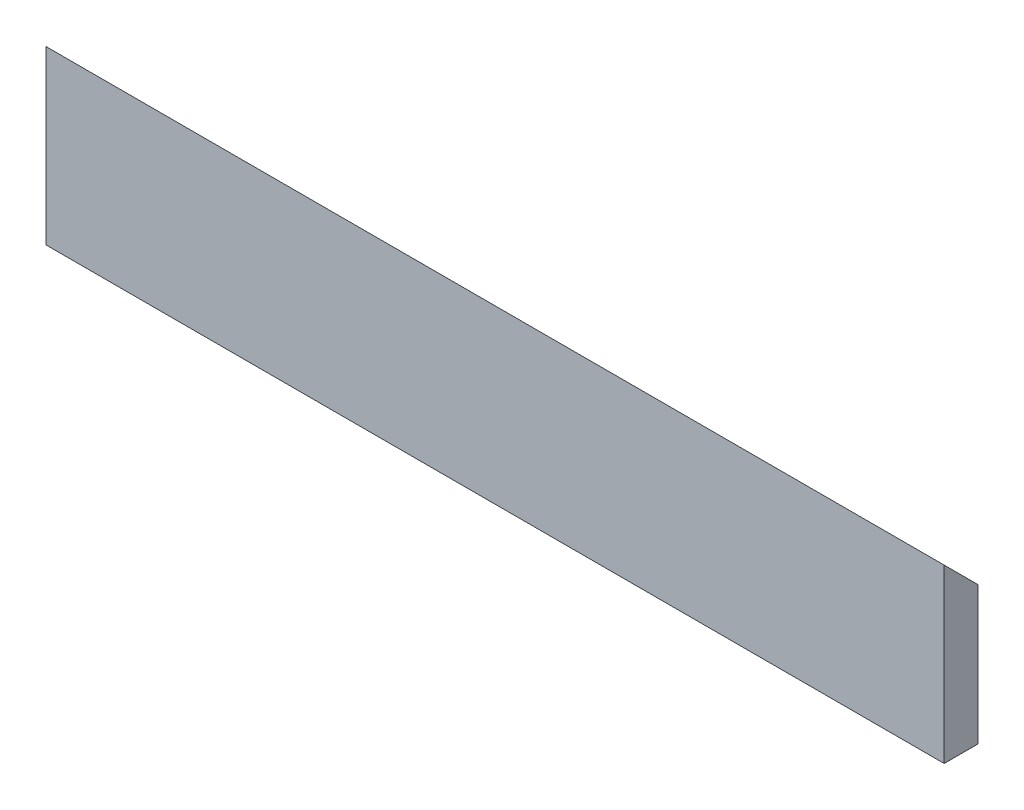
ISO-10303-21;
HEADER;
FILE_DESCRIPTION(('STEP AP214'),'2;1');
FILE_NAME('part.step','',(''),(''),'','','');
FILE_SCHEMA(('AUTOMOTIVE_DESIGN { 1 0 10303 214 1 1 1 1 }'));
ENDSEC;
DATA;
#1=APPLICATION_CONTEXT('core data for automotive mechanical design processes');
#2=APPLICATION_PROTOCOL_DEFINITION('international standard','automotive_design',2000,#1);
#3=PRODUCT_CONTEXT('',#1,'mechanical');
#4=PRODUCT('Part','Part','',(#3));
#5=PRODUCT_RELATED_PRODUCT_CATEGORY('part','',(#4));
#6=PRODUCT_DEFINITION_FORMATION('','',#4);
#7=PRODUCT_DEFINITION_CONTEXT('part definition',#1,'design');
#8=PRODUCT_DEFINITION('design','',#6,#7);
#9=PRODUCT_DEFINITION_SHAPE('','',#8);
#10=(LENGTH_UNIT() NAMED_UNIT(*) SI_UNIT(.MILLI.,.METRE.));
#11=(NAMED_UNIT(*) PLANE_ANGLE_UNIT() SI_UNIT($,.RADIAN.));
#12=(NAMED_UNIT(*) SI_UNIT($,.STERADIAN.) SOLID_ANGLE_UNIT());
#13=UNCERTAINTY_MEASURE_WITH_UNIT(LENGTH_MEASURE(1.E-05),#10,'distance_accuracy_value','');
#14=(GEOMETRIC_REPRESENTATION_CONTEXT(3) GLOBAL_UNCERTAINTY_ASSIGNED_CONTEXT((#13)) GLOBAL_UNIT_ASSIGNED_CONTEXT((#10,
#11,#12)) REPRESENTATION_CONTEXT('',''));
#15=CARTESIAN_POINT('',(0.,0.,0.));
#16=DIRECTION('',(0.,0.,1.));
#17=DIRECTION('',(1.,0.,0.));
#18=AXIS2_PLACEMENT_3D('',#15,#16,#17);
#19=CARTESIAN_POINT('',(0.,0.,15.));
#20=DIRECTION('',(1.,0.,0.));
#21=DIRECTION('',(0.,0.,-1.));
#22=AXIS2_PLACEMENT_3D('',#19,#20,#21);
#23=PLANE('',#22);
#24=DIRECTION('',(0.,-1.,0.));
#25=VECTOR('',#24,1.);
#26=CARTESIAN_POINT('',(0.,0.,15.));
#27=LINE('',#26,#25);
#28=CARTESIAN_POINT('',(0.,76.2,15.));
#29=VERTEX_POINT('',#28);
#30=CARTESIAN_POINT('',(0.,0.,15.));
#31=VERTEX_POINT('',#30);
#32=EDGE_CURVE('E88',#29,#31,#27,.T.);
#33=ORIENTED_EDGE('',*,*,#32,.F.);
#34=DIRECTION('',(0.,0.707106781186547,0.707106781186547));
#35=VECTOR('',#34,1.);
#36=CARTESIAN_POINT('',(0.,76.2,15.));
#37=LINE('',#36,#35);
#38=CARTESIAN_POINT('',(0.,61.2,0.));
#39=VERTEX_POINT('',#38);
#40=EDGE_CURVE('E137',#39,#29,#37,.T.);
#41=ORIENTED_EDGE('',*,*,#40,.F.);
#42=DIRECTION('',(0.,-1.,0.));
#43=VECTOR('',#42,1.);
#44=CARTESIAN_POINT('',(0.,0.,0.));
#45=LINE('',#44,#43);
#46=CARTESIAN_POINT('',(0.,0.,0.));
#47=VERTEX_POINT('',#46);
#48=EDGE_CURVE('E78',#39,#47,#45,.T.);
#49=ORIENTED_EDGE('',*,*,#48,.T.);
#50=DIRECTION('',(0.,0.,-1.));
#51=VECTOR('',#50,1.);
#52=CARTESIAN_POINT('',(0.,0.,15.));
#53=LINE('',#52,#51);
#54=EDGE_CURVE('E11',#31,#47,#53,.T.);
#55=ORIENTED_EDGE('',*,*,#54,.F.);
#56=EDGE_LOOP('',(#33,#41,#49,#55));
#57=FACE_BOUND('',#56,.T.);
#58=ADVANCED_FACE('F33',(#57),#23,.F.);
#59=CARTESIAN_POINT('',(322.1,0.,15.));
#60=DIRECTION('',(0.,1.,0.));
#61=DIRECTION('',(0.,0.,1.));
#62=AXIS2_PLACEMENT_3D('',#59,#60,#61);
#63=PLANE('',#62);
#64=DIRECTION('',(1.,0.,0.));
#65=VECTOR('',#64,1.);
#66=CARTESIAN_POINT('',(322.1,0.,0.));
#67=LINE('',#66,#65);
#68=CARTESIAN_POINT('',(398.3,0.,0.));
#69=VERTEX_POINT('',#68);
#70=EDGE_CURVE('E69',#47,#69,#67,.T.);
#71=ORIENTED_EDGE('',*,*,#70,.T.);
#72=DIRECTION('',(0.,0.,-1.));
#73=VECTOR('',#72,1.);
#74=CARTESIAN_POINT('',(398.3,0.,15.));
#75=LINE('',#74,#73);
#76=CARTESIAN_POINT('',(398.3,0.,15.));
#77=VERTEX_POINT('',#76);
#78=EDGE_CURVE('E41',#77,#69,#75,.T.);
#79=ORIENTED_EDGE('',*,*,#78,.F.);
#80=DIRECTION('',(1.,0.,0.));
#81=VECTOR('',#80,1.);
#82=CARTESIAN_POINT('',(0.,0.,15.));
#83=LINE('',#82,#81);
#84=EDGE_CURVE('E57',#31,#77,#83,.T.);
#85=ORIENTED_EDGE('',*,*,#84,.F.);
#86=ORIENTED_EDGE('',*,*,#54,.T.);
#87=EDGE_LOOP('',(#71,#79,#85,#86));
#88=FACE_BOUND('',#87,.T.);
#89=ADVANCED_FACE('F71',(#88),#63,.F.);
#90=CARTESIAN_POINT('',(398.3,76.2,15.));
#91=DIRECTION('',(-1.,0.,0.));
#92=DIRECTION('',(0.,0.,1.));
#93=AXIS2_PLACEMENT_3D('',#90,#91,#92);
#94=PLANE('',#93);
#95=DIRECTION('',(0.,1.,0.));
#96=VECTOR('',#95,1.);
#97=CARTESIAN_POINT('',(398.3,76.2,0.));
#98=LINE('',#97,#96);
#99=CARTESIAN_POINT('',(398.3,61.2,0.));
#100=VERTEX_POINT('',#99);
#101=EDGE_CURVE('E77',#69,#100,#98,.T.);
#102=ORIENTED_EDGE('',*,*,#101,.T.);
#103=DIRECTION('',(0.,0.707106781186547,0.707106781186547));
#104=VECTOR('',#103,1.);
#105=CARTESIAN_POINT('',(398.3,76.2,15.));
#106=LINE('',#105,#104);
#107=CARTESIAN_POINT('',(398.3,76.2,15.));
#108=VERTEX_POINT('',#107);
#109=EDGE_CURVE('E48',#100,#108,#106,.T.);
#110=ORIENTED_EDGE('',*,*,#109,.T.);
#111=DIRECTION('',(0.,1.,0.));
#112=VECTOR('',#111,1.);
#113=CARTESIAN_POINT('',(398.3,76.2,15.));
#114=LINE('',#113,#112);
#115=EDGE_CURVE('E83',#77,#108,#114,.T.);
#116=ORIENTED_EDGE('',*,*,#115,.F.);
#117=ORIENTED_EDGE('',*,*,#78,.T.);
#118=EDGE_LOOP('',(#102,#110,#116,#117));
#119=FACE_BOUND('',#118,.T.);
#120=ADVANCED_FACE('F82',(#119),#94,.F.);
#121=CARTESIAN_POINT('',(0.,0.,15.));
#122=DIRECTION('',(0.,0.,-1.));
#123=DIRECTION('',(-1.,0.,0.));
#124=AXIS2_PLACEMENT_3D('',#121,#122,#123);
#125=PLANE('',#124);
#126=ORIENTED_EDGE('',*,*,#32,.T.);
#127=ORIENTED_EDGE('',*,*,#84,.T.);
#128=ORIENTED_EDGE('',*,*,#115,.T.);
#129=DIRECTION('',(-1.,0.,0.));
#130=VECTOR('',#129,1.);
#131=CARTESIAN_POINT('',(322.1,76.2,15.));
#132=LINE('',#131,#130);
#133=EDGE_CURVE('E84',#108,#29,#132,.T.);
#134=ORIENTED_EDGE('',*,*,#133,.T.);
#135=EDGE_LOOP('',(#126,#127,#128,#134));
#136=FACE_BOUND('',#135,.T.);
#137=ADVANCED_FACE('F142',(#136),#125,.F.);
#138=CARTESIAN_POINT('',(0.,0.,0.));
#139=DIRECTION('',(0.,0.,-1.));
#140=DIRECTION('',(-1.,0.,0.));
#141=AXIS2_PLACEMENT_3D('',#138,#139,#140);
#142=PLANE('',#141);
#143=DIRECTION('',(-1.,0.,0.));
#144=VECTOR('',#143,1.);
#145=CARTESIAN_POINT('',(398.3,61.2,0.));
#146=LINE('',#145,#144);
#147=EDGE_CURVE('E87',#100,#39,#146,.T.);
#148=ORIENTED_EDGE('',*,*,#147,.F.);
#149=ORIENTED_EDGE('',*,*,#101,.F.);
#150=ORIENTED_EDGE('',*,*,#70,.F.);
#151=ORIENTED_EDGE('',*,*,#48,.F.);
#152=EDGE_LOOP('',(#148,#149,#150,#151));
#153=FACE_BOUND('',#152,.T.);
#154=ADVANCED_FACE('F86',(#153),#142,.T.);
#155=CARTESIAN_POINT('',(398.3,76.2,15.));
#156=DIRECTION('',(0.,-0.707106781186547,0.707106781186547));
#157=DIRECTION('',(0.,-0.707106781186548,-0.707106781186548));
#158=AXIS2_PLACEMENT_3D('',#155,#156,#157);
#159=PLANE('',#158);
#160=CARTESIAN_POINT('',(157.514854478127,68.7,7.5));
#161=DIRECTION('',(0.,-0.707106781186547,0.707106781186547));
#162=DIRECTION('',(0.,0.707106781186548,0.707106781186548));
#163=AXIS2_PLACEMENT_3D('',#160,#161,#162);
#164=ELLIPSE('',#163,1.41421356237309,0.999999999999998);
#165=CARTESIAN_POINT('',(157.514854478127,69.7,8.5));
#166=VERTEX_POINT('',#165);
#167=EDGE_CURVE('E105',#166,#166,#164,.T.);
#168=ORIENTED_EDGE('',*,*,#167,.T.);
#169=EDGE_LOOP('',(#168));
#170=FACE_BOUND('',#169,.T.);
#171=CARTESIAN_POINT('',(43.2148544781275,68.7000000000008,7.5000000000008));
#172=DIRECTION('',(0.,-0.707106781186547,0.707106781186547));
#173=DIRECTION('',(0.,0.707106781186548,0.707106781186548));
#174=AXIS2_PLACEMENT_3D('',#171,#172,#173);
#175=ELLIPSE('',#174,1.41421356237309,0.999999999999998);
#176=CARTESIAN_POINT('',(43.2148544781275,69.7000000000008,8.5000000000008));
#177=VERTEX_POINT('',#176);
#178=EDGE_CURVE('E121',#177,#177,#175,.T.);
#179=ORIENTED_EDGE('',*,*,#178,.T.);
#180=EDGE_LOOP('',(#179));
#181=FACE_BOUND('',#180,.T.);
#182=CARTESIAN_POINT('',(81.3148544781275,68.7000000000005,7.50000000000053));
#183=DIRECTION('',(0.,-0.707106781186547,0.707106781186547));
#184=DIRECTION('',(0.,0.707106781186548,0.707106781186548));
#185=AXIS2_PLACEMENT_3D('',#182,#183,#184);
#186=ELLIPSE('',#185,1.41421356237309,0.999999999999998);
#187=CARTESIAN_POINT('',(81.3148544781275,69.7000000000005,8.50000000000053));
#188=VERTEX_POINT('',#187);
#189=EDGE_CURVE('E124',#188,#188,#186,.T.);
#190=ORIENTED_EDGE('',*,*,#189,.T.);
#191=EDGE_LOOP('',(#190));
#192=FACE_BOUND('',#191,.T.);
#193=CARTESIAN_POINT('',(119.414854478127,68.7000000000003,7.50000000000027));
#194=DIRECTION('',(0.,-0.707106781186547,0.707106781186547));
#195=DIRECTION('',(0.,0.707106781186548,0.707106781186548));
#196=AXIS2_PLACEMENT_3D('',#193,#194,#195);
#197=ELLIPSE('',#196,1.41421356237309,0.999999999999998);
#198=CARTESIAN_POINT('',(119.414854478127,69.7000000000003,8.50000000000026));
#199=VERTEX_POINT('',#198);
#200=EDGE_CURVE('E127',#199,#199,#197,.T.);
#201=ORIENTED_EDGE('',*,*,#200,.T.);
#202=EDGE_LOOP('',(#201));
#203=FACE_BOUND('',#202,.T.);
#204=CARTESIAN_POINT('',(271.814854478127,68.7,7.5));
#205=DIRECTION('',(0.,-0.707106781186547,0.707106781186547));
#206=DIRECTION('',(0.,0.707106781186548,0.707106781186548));
#207=AXIS2_PLACEMENT_3D('',#204,#205,#206);
#208=ELLIPSE('',#207,1.41421356237317,1.00000000000005);
#209=CARTESIAN_POINT('',(271.814854478127,69.7000000000001,8.50000000000005));
#210=VERTEX_POINT('',#209);
#211=EDGE_CURVE('E130',#210,#210,#208,.T.);
#212=ORIENTED_EDGE('',*,*,#211,.T.);
#213=EDGE_LOOP('',(#212));
#214=FACE_BOUND('',#213,.T.);
#215=CARTESIAN_POINT('',(233.714854478128,68.7,7.5));
#216=DIRECTION('',(0.,-0.707106781186547,0.707106781186547));
#217=DIRECTION('',(0.,0.707106781186548,0.707106781186548));
#218=AXIS2_PLACEMENT_3D('',#215,#216,#217);
#219=ELLIPSE('',#218,1.41421356237309,0.999999999999998);
#220=CARTESIAN_POINT('',(233.714854478128,69.7,8.5));
#221=VERTEX_POINT('',#220);
#222=EDGE_CURVE('E133',#221,#221,#219,.T.);
#223=ORIENTED_EDGE('',*,*,#222,.T.);
#224=EDGE_LOOP('',(#223));
#225=FACE_BOUND('',#224,.T.);
#226=CARTESIAN_POINT('',(195.614854478127,68.7,7.5));
#227=DIRECTION('',(0.,-0.707106781186547,0.707106781186547));
#228=DIRECTION('',(0.,0.707106781186548,0.707106781186548));
#229=AXIS2_PLACEMENT_3D('',#226,#227,#228);
#230=ELLIPSE('',#229,1.41421356237309,0.999999999999998);
#231=CARTESIAN_POINT('',(195.614854478127,69.7,8.5));
#232=VERTEX_POINT('',#231);
#233=EDGE_CURVE('E36',#232,#232,#230,.T.);
#234=ORIENTED_EDGE('',*,*,#233,.T.);
#235=EDGE_LOOP('',(#234));
#236=FACE_BOUND('',#235,.T.);
#237=ORIENTED_EDGE('',*,*,#40,.T.);
#238=ORIENTED_EDGE('',*,*,#133,.F.);
#239=ORIENTED_EDGE('',*,*,#109,.F.);
#240=ORIENTED_EDGE('',*,*,#147,.T.);
#241=EDGE_LOOP('',(#237,#238,#239,#240));
#242=FACE_BOUND('',#241,.T.);
#243=ADVANCED_FACE('F148',(#170,#181,#192,#203,#214,#225,#236,#242),#159,.F.);
#244=CARTESIAN_POINT('',(233.714854478128,25.4,7.5));
#245=DIRECTION('',(0.,-1.,0.));
#246=DIRECTION('',(0.,0.,-1.));
#247=AXIS2_PLACEMENT_3D('',#244,#245,#246);
#248=PLANE('',#247);
#249=CARTESIAN_POINT('',(233.714854478128,25.4,7.5));
#250=DIRECTION('',(0.,-1.,0.));
#251=DIRECTION('',(0.,0.,-1.));
#252=AXIS2_PLACEMENT_3D('',#249,#250,#251);
#253=CIRCLE('',#252,0.999999999999998);
#254=CARTESIAN_POINT('',(233.714854478128,25.4,6.5));
#255=VERTEX_POINT('',#254);
#256=EDGE_CURVE('E114',#255,#255,#253,.T.);
#257=ORIENTED_EDGE('',*,*,#256,.F.);
#258=EDGE_LOOP('',(#257));
#259=FACE_BOUND('',#258,.T.);
#260=ADVANCED_FACE('F150',(#259),#248,.F.);
#261=CARTESIAN_POINT('',(233.714854478128,25.4,7.5));
#262=DIRECTION('',(0.,1.,0.));
#263=DIRECTION('',(0.,0.,1.));
#264=AXIS2_PLACEMENT_3D('',#261,#262,#263);
#265=CYLINDRICAL_SURFACE('',#264,0.999999999999998);
#266=ORIENTED_EDGE('',*,*,#222,.F.);
#267=EDGE_LOOP('',(#266));
#268=FACE_BOUND('',#267,.T.);
#269=ORIENTED_EDGE('',*,*,#256,.T.);
#270=EDGE_LOOP('',(#269));
#271=FACE_BOUND('',#270,.T.);
#272=ADVANCED_FACE('F157',(#268,#271),#265,.F.);
#273=CARTESIAN_POINT('',(271.814854478127,25.4,7.5));
#274=DIRECTION('',(0.,-1.,0.));
#275=DIRECTION('',(0.,0.,-1.));
#276=AXIS2_PLACEMENT_3D('',#273,#274,#275);
#277=PLANE('',#276);
#278=CARTESIAN_POINT('',(271.814854478127,25.4,7.5));
#279=DIRECTION('',(0.,-1.,0.));
#280=DIRECTION('',(0.,0.,-1.));
#281=AXIS2_PLACEMENT_3D('',#278,#279,#280);
#282=CIRCLE('',#281,1.00000000000005);
#283=CARTESIAN_POINT('',(271.814854478127,25.4,6.49999999999995));
#284=VERTEX_POINT('',#283);
#285=EDGE_CURVE('E111',#284,#284,#282,.T.);
#286=ORIENTED_EDGE('',*,*,#285,.F.);
#287=EDGE_LOOP('',(#286));
#288=FACE_BOUND('',#287,.T.);
#289=ADVANCED_FACE('F210',(#288),#277,.F.);
#290=CARTESIAN_POINT('',(271.814854478127,25.4,7.5));
#291=DIRECTION('',(0.,1.,0.));
#292=DIRECTION('',(0.,0.,1.));
#293=AXIS2_PLACEMENT_3D('',#290,#291,#292);
#294=CYLINDRICAL_SURFACE('',#293,1.00000000000005);
#295=ORIENTED_EDGE('',*,*,#211,.F.);
#296=EDGE_LOOP('',(#295));
#297=FACE_BOUND('',#296,.T.);
#298=ORIENTED_EDGE('',*,*,#285,.T.);
#299=EDGE_LOOP('',(#298));
#300=FACE_BOUND('',#299,.T.);
#301=ADVANCED_FACE('F206',(#297,#300),#294,.F.);
#302=CARTESIAN_POINT('',(119.414854478127,25.4,7.50000000000027));
#303=DIRECTION('',(0.,-1.,0.));
#304=DIRECTION('',(0.,0.,-1.));
#305=AXIS2_PLACEMENT_3D('',#302,#303,#304);
#306=PLANE('',#305);
#307=CARTESIAN_POINT('',(119.414854478127,25.4,7.50000000000027));
#308=DIRECTION('',(0.,-1.,0.));
#309=DIRECTION('',(0.,0.,-1.));
#310=AXIS2_PLACEMENT_3D('',#307,#308,#309);
#311=CIRCLE('',#310,0.999999999999998);
#312=CARTESIAN_POINT('',(119.414854478127,25.4,6.50000000000027));
#313=VERTEX_POINT('',#312);
#314=EDGE_CURVE('E108',#313,#313,#311,.T.);
#315=ORIENTED_EDGE('',*,*,#314,.F.);
#316=EDGE_LOOP('',(#315));
#317=FACE_BOUND('',#316,.T.);
#318=ADVANCED_FACE('F202',(#317),#306,.F.);
#319=CARTESIAN_POINT('',(119.414854478127,25.4,7.50000000000027));
#320=DIRECTION('',(0.,1.,0.));
#321=DIRECTION('',(0.,0.,1.));
#322=AXIS2_PLACEMENT_3D('',#319,#320,#321);
#323=CYLINDRICAL_SURFACE('',#322,0.999999999999998);
#324=ORIENTED_EDGE('',*,*,#200,.F.);
#325=EDGE_LOOP('',(#324));
#326=FACE_BOUND('',#325,.T.);
#327=ORIENTED_EDGE('',*,*,#314,.T.);
#328=EDGE_LOOP('',(#327));
#329=FACE_BOUND('',#328,.T.);
#330=ADVANCED_FACE('F198',(#326,#329),#323,.F.);
#331=CARTESIAN_POINT('',(81.3148544781275,25.4,7.50000000000053));
#332=DIRECTION('',(0.,-1.,0.));
#333=DIRECTION('',(0.,0.,-1.));
#334=AXIS2_PLACEMENT_3D('',#331,#332,#333);
#335=PLANE('',#334);
#336=CARTESIAN_POINT('',(81.3148544781275,25.4,7.50000000000053));
#337=DIRECTION('',(0.,-1.,0.));
#338=DIRECTION('',(0.,0.,-1.));
#339=AXIS2_PLACEMENT_3D('',#336,#337,#338);
#340=CIRCLE('',#339,0.999999999999998);
#341=CARTESIAN_POINT('',(81.3148544781275,25.4,6.50000000000053));
#342=VERTEX_POINT('',#341);
#343=EDGE_CURVE('E104',#342,#342,#340,.T.);
#344=ORIENTED_EDGE('',*,*,#343,.F.);
#345=EDGE_LOOP('',(#344));
#346=FACE_BOUND('',#345,.T.);
#347=ADVANCED_FACE('F194',(#346),#335,.F.);
#348=CARTESIAN_POINT('',(81.3148544781275,25.4,7.50000000000053));
#349=DIRECTION('',(0.,1.,0.));
#350=DIRECTION('',(0.,0.,1.));
#351=AXIS2_PLACEMENT_3D('',#348,#349,#350);
#352=CYLINDRICAL_SURFACE('',#351,0.999999999999998);
#353=ORIENTED_EDGE('',*,*,#189,.F.);
#354=EDGE_LOOP('',(#353));
#355=FACE_BOUND('',#354,.T.);
#356=ORIENTED_EDGE('',*,*,#343,.T.);
#357=EDGE_LOOP('',(#356));
#358=FACE_BOUND('',#357,.T.);
#359=ADVANCED_FACE('F190',(#355,#358),#352,.F.);
#360=CARTESIAN_POINT('',(43.2148544781275,25.4,7.5000000000008));
#361=DIRECTION('',(0.,-1.,0.));
#362=DIRECTION('',(0.,0.,-1.));
#363=AXIS2_PLACEMENT_3D('',#360,#361,#362);
#364=PLANE('',#363);
#365=CARTESIAN_POINT('',(43.2148544781275,25.4,7.5000000000008));
#366=DIRECTION('',(0.,-1.,0.));
#367=DIRECTION('',(0.,0.,-1.));
#368=AXIS2_PLACEMENT_3D('',#365,#366,#367);
#369=CIRCLE('',#368,0.999999999999998);
#370=CARTESIAN_POINT('',(43.2148544781275,25.4,6.5000000000008));
#371=VERTEX_POINT('',#370);
#372=EDGE_CURVE('E101',#371,#371,#369,.T.);
#373=ORIENTED_EDGE('',*,*,#372,.F.);
#374=EDGE_LOOP('',(#373));
#375=FACE_BOUND('',#374,.T.);
#376=ADVANCED_FACE('F186',(#375),#364,.F.);
#377=CARTESIAN_POINT('',(43.2148544781275,25.4,7.5000000000008));
#378=DIRECTION('',(0.,1.,0.));
#379=DIRECTION('',(0.,0.,1.));
#380=AXIS2_PLACEMENT_3D('',#377,#378,#379);
#381=CYLINDRICAL_SURFACE('',#380,0.999999999999998);
#382=ORIENTED_EDGE('',*,*,#178,.F.);
#383=EDGE_LOOP('',(#382));
#384=FACE_BOUND('',#383,.T.);
#385=ORIENTED_EDGE('',*,*,#372,.T.);
#386=EDGE_LOOP('',(#385));
#387=FACE_BOUND('',#386,.T.);
#388=ADVANCED_FACE('F182',(#384,#387),#381,.F.);
#389=CARTESIAN_POINT('',(157.514854478127,25.4,7.5));
#390=DIRECTION('',(0.,-1.,0.));
#391=DIRECTION('',(0.,0.,-1.));
#392=AXIS2_PLACEMENT_3D('',#389,#390,#391);
#393=PLANE('',#392);
#394=CARTESIAN_POINT('',(157.514854478127,25.4,7.5));
#395=DIRECTION('',(0.,-1.,0.));
#396=DIRECTION('',(0.,0.,-1.));
#397=AXIS2_PLACEMENT_3D('',#394,#395,#396);
#398=CIRCLE('',#397,0.999999999999998);
#399=CARTESIAN_POINT('',(157.514854478127,25.4,6.5));
#400=VERTEX_POINT('',#399);
#401=EDGE_CURVE('E93',#400,#400,#398,.T.);
#402=ORIENTED_EDGE('',*,*,#401,.F.);
#403=EDGE_LOOP('',(#402));
#404=FACE_BOUND('',#403,.T.);
#405=ADVANCED_FACE('F178',(#404),#393,.F.);
#406=CARTESIAN_POINT('',(157.514854478127,25.4,7.5));
#407=DIRECTION('',(0.,1.,0.));
#408=DIRECTION('',(0.,0.,1.));
#409=AXIS2_PLACEMENT_3D('',#406,#407,#408);
#410=CYLINDRICAL_SURFACE('',#409,0.999999999999998);
#411=ORIENTED_EDGE('',*,*,#167,.F.);
#412=EDGE_LOOP('',(#411));
#413=FACE_BOUND('',#412,.T.);
#414=ORIENTED_EDGE('',*,*,#401,.T.);
#415=EDGE_LOOP('',(#414));
#416=FACE_BOUND('',#415,.T.);
#417=ADVANCED_FACE('F174',(#413,#416),#410,.F.);
#418=CARTESIAN_POINT('',(195.614854478127,25.4,7.5));
#419=DIRECTION('',(0.,-1.,0.));
#420=DIRECTION('',(0.,0.,-1.));
#421=AXIS2_PLACEMENT_3D('',#418,#419,#420);
#422=PLANE('',#421);
#423=CARTESIAN_POINT('',(195.614854478127,25.4,7.5));
#424=DIRECTION('',(0.,-1.,0.));
#425=DIRECTION('',(0.,0.,-1.));
#426=AXIS2_PLACEMENT_3D('',#423,#424,#425);
#427=CIRCLE('',#426,0.999999999999998);
#428=CARTESIAN_POINT('',(195.614854478127,25.4,6.5));
#429=VERTEX_POINT('',#428);
#430=EDGE_CURVE('E100',#429,#429,#427,.T.);
#431=ORIENTED_EDGE('',*,*,#430,.F.);
#432=EDGE_LOOP('',(#431));
#433=FACE_BOUND('',#432,.T.);
#434=ADVANCED_FACE('F177',(#433),#422,.F.);
#435=CARTESIAN_POINT('',(195.614854478127,25.4,7.5));
#436=DIRECTION('',(0.,1.,0.));
#437=DIRECTION('',(0.,0.,1.));
#438=AXIS2_PLACEMENT_3D('',#435,#436,#437);
#439=CYLINDRICAL_SURFACE('',#438,0.999999999999998);
#440=ORIENTED_EDGE('',*,*,#233,.F.);
#441=EDGE_LOOP('',(#440));
#442=FACE_BOUND('',#441,.T.);
#443=ORIENTED_EDGE('',*,*,#430,.T.);
#444=EDGE_LOOP('',(#443));
#445=FACE_BOUND('',#444,.T.);
#446=ADVANCED_FACE('F218',(#442,#445),#439,.F.);
#447=CLOSED_SHELL('',(#58,#89,#120,#137,#154,#243,#260,#272,#289,#301,#318,#330,#347,#359,#376,
#388,#405,#417,#434,#446));
#448=MANIFOLD_SOLID_BREP('B2',#447);
#449=ADVANCED_BREP_SHAPE_REPRESENTATION('',(#18,#448),#14);
#450=SHAPE_DEFINITION_REPRESENTATION(#9,#449);
ENDSEC;
END-ISO-10303-21;
